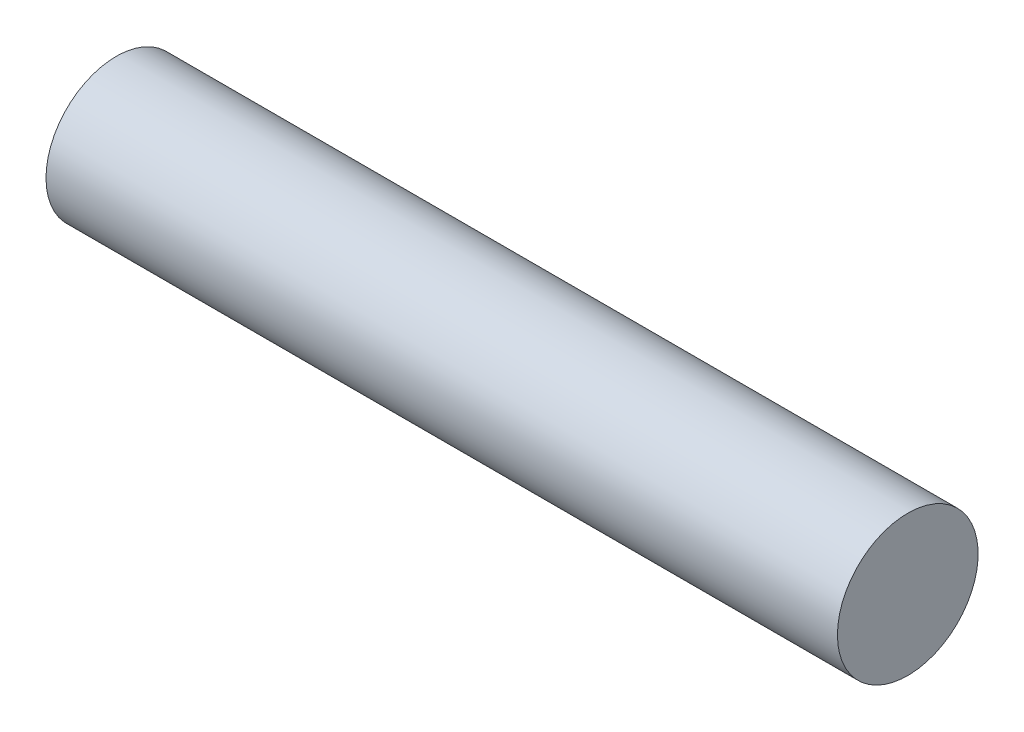
ISO-10303-21;
HEADER;
FILE_DESCRIPTION(('STEP AP214'),'2;1');
FILE_NAME('part.step','',(''),(''),'','','');
FILE_SCHEMA(('AUTOMOTIVE_DESIGN { 1 0 10303 214 1 1 1 1 }'));
ENDSEC;
DATA;
#1=APPLICATION_CONTEXT('core data for automotive mechanical design processes');
#2=APPLICATION_PROTOCOL_DEFINITION('international standard','automotive_design',2000,#1);
#3=PRODUCT_CONTEXT('',#1,'mechanical');
#4=PRODUCT('Part','Part','',(#3));
#5=PRODUCT_RELATED_PRODUCT_CATEGORY('part','',(#4));
#6=PRODUCT_DEFINITION_FORMATION('','',#4);
#7=PRODUCT_DEFINITION_CONTEXT('part definition',#1,'design');
#8=PRODUCT_DEFINITION('design','',#6,#7);
#9=PRODUCT_DEFINITION_SHAPE('','',#8);
#10=(LENGTH_UNIT() NAMED_UNIT(*) SI_UNIT(.MILLI.,.METRE.));
#11=(NAMED_UNIT(*) PLANE_ANGLE_UNIT() SI_UNIT($,.RADIAN.));
#12=(NAMED_UNIT(*) SI_UNIT($,.STERADIAN.) SOLID_ANGLE_UNIT());
#13=UNCERTAINTY_MEASURE_WITH_UNIT(LENGTH_MEASURE(1.E-05),#10,'distance_accuracy_value','');
#14=(GEOMETRIC_REPRESENTATION_CONTEXT(3) GLOBAL_UNCERTAINTY_ASSIGNED_CONTEXT((#13)) GLOBAL_UNIT_ASSIGNED_CONTEXT((#10,
#11,#12)) REPRESENTATION_CONTEXT('',''));
#15=CARTESIAN_POINT('',(0.,0.,0.));
#16=DIRECTION('',(0.,0.,1.));
#17=DIRECTION('',(1.,0.,0.));
#18=AXIS2_PLACEMENT_3D('',#15,#16,#17);
#19=CARTESIAN_POINT('',(0.,0.,0.));
#20=DIRECTION('',(1.,0.,0.));
#21=DIRECTION('',(0.,0.,-1.));
#22=AXIS2_PLACEMENT_3D('',#19,#20,#21);
#23=PLANE('',#22);
#24=CARTESIAN_POINT('',(0.,0.,0.));
#25=DIRECTION('',(-1.,0.,0.));
#26=DIRECTION('',(0.,0.,1.));
#27=AXIS2_PLACEMENT_3D('',#24,#25,#26);
#28=CIRCLE('',#27,8.);
#29=CARTESIAN_POINT('',(0.,0.,8.));
#30=VERTEX_POINT('',#29);
#31=EDGE_CURVE('E10',#30,#30,#28,.T.);
#32=ORIENTED_EDGE('',*,*,#31,.T.);
#33=EDGE_LOOP('',(#32));
#34=FACE_BOUND('',#33,.T.);
#35=ADVANCED_FACE('F41',(#34),#23,.F.);
#36=CARTESIAN_POINT('',(0.,0.,0.));
#37=DIRECTION('',(-1.,0.,0.));
#38=DIRECTION('',(0.,0.,1.));
#39=AXIS2_PLACEMENT_3D('',#36,#37,#38);
#40=CYLINDRICAL_SURFACE('',#39,8.);
#41=ORIENTED_EDGE('',*,*,#31,.F.);
#42=EDGE_LOOP('',(#41));
#43=FACE_BOUND('',#42,.T.);
#44=CARTESIAN_POINT('',(90.,0.,0.));
#45=DIRECTION('',(-1.,0.,0.));
#46=DIRECTION('',(0.,0.,1.));
#47=AXIS2_PLACEMENT_3D('',#44,#45,#46);
#48=CIRCLE('',#47,8.);
#49=CARTESIAN_POINT('',(90.,0.,8.));
#50=VERTEX_POINT('',#49);
#51=EDGE_CURVE('E47',#50,#50,#48,.T.);
#52=ORIENTED_EDGE('',*,*,#51,.T.);
#53=EDGE_LOOP('',(#52));
#54=FACE_BOUND('',#53,.T.);
#55=ADVANCED_FACE('F53',(#43,#54),#40,.T.);
#56=CARTESIAN_POINT('',(90.,8.,0.));
#57=DIRECTION('',(-1.,0.,0.));
#58=DIRECTION('',(0.,0.,1.));
#59=AXIS2_PLACEMENT_3D('',#56,#57,#58);
#60=PLANE('',#59);
#61=ORIENTED_EDGE('',*,*,#51,.F.);
#62=EDGE_LOOP('',(#61));
#63=FACE_BOUND('',#62,.T.);
#64=ADVANCED_FACE('F55',(#63),#60,.F.);
#65=CLOSED_SHELL('',(#35,#55,#64));
#66=MANIFOLD_SOLID_BREP('B2',#65);
#67=ADVANCED_BREP_SHAPE_REPRESENTATION('',(#18,#66),#14);
#68=SHAPE_DEFINITION_REPRESENTATION(#9,#67);
ENDSEC;
END-ISO-10303-21;
